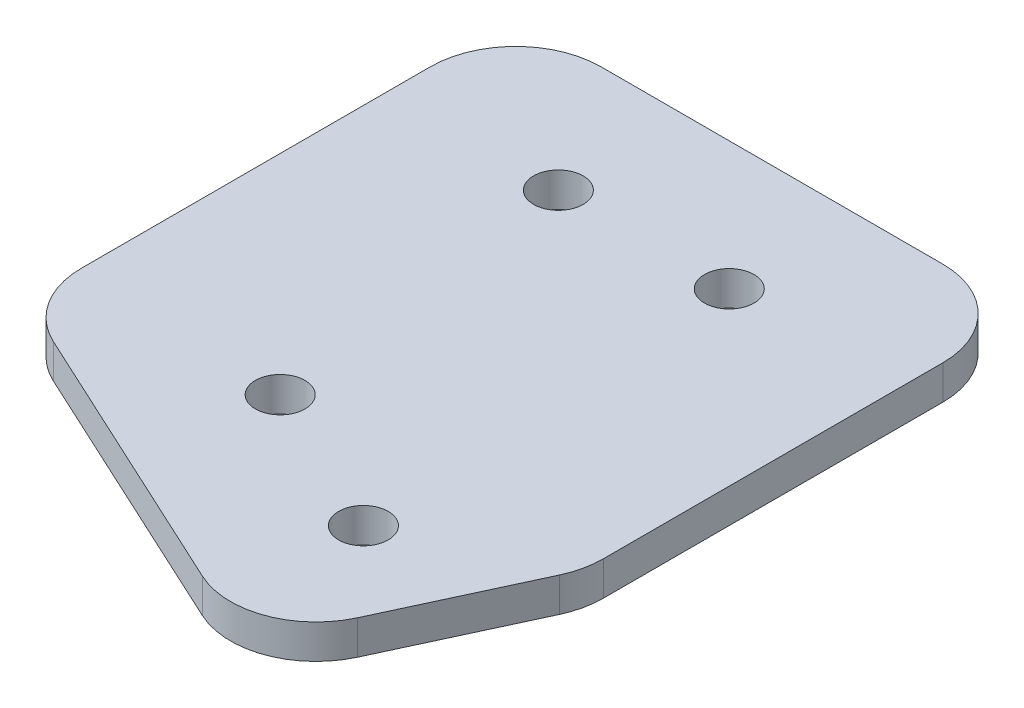
ISO-10303-21;
HEADER;
FILE_DESCRIPTION(('STEP AP214'),'2;1');
FILE_NAME('part.step','',(''),(''),'','','');
FILE_SCHEMA(('AUTOMOTIVE_DESIGN { 1 0 10303 214 1 1 1 1 }'));
ENDSEC;
DATA;
#1=APPLICATION_CONTEXT('core data for automotive mechanical design processes');
#2=APPLICATION_PROTOCOL_DEFINITION('international standard','automotive_design',2000,#1);
#3=PRODUCT_CONTEXT('',#1,'mechanical');
#4=PRODUCT('Part','Part','',(#3));
#5=PRODUCT_RELATED_PRODUCT_CATEGORY('part','',(#4));
#6=PRODUCT_DEFINITION_FORMATION('','',#4);
#7=PRODUCT_DEFINITION_CONTEXT('part definition',#1,'design');
#8=PRODUCT_DEFINITION('design','',#6,#7);
#9=PRODUCT_DEFINITION_SHAPE('','',#8);
#10=(LENGTH_UNIT() NAMED_UNIT(*) SI_UNIT(.MILLI.,.METRE.));
#11=(NAMED_UNIT(*) PLANE_ANGLE_UNIT() SI_UNIT($,.RADIAN.));
#12=(NAMED_UNIT(*) SI_UNIT($,.STERADIAN.) SOLID_ANGLE_UNIT());
#13=UNCERTAINTY_MEASURE_WITH_UNIT(LENGTH_MEASURE(1.E-05),#10,'distance_accuracy_value','');
#14=(GEOMETRIC_REPRESENTATION_CONTEXT(3) GLOBAL_UNCERTAINTY_ASSIGNED_CONTEXT((#13)) GLOBAL_UNIT_ASSIGNED_CONTEXT((#10,
#11,#12)) REPRESENTATION_CONTEXT('',''));
#15=CARTESIAN_POINT('',(0.,0.,0.));
#16=DIRECTION('',(0.,0.,1.));
#17=DIRECTION('',(1.,0.,0.));
#18=AXIS2_PLACEMENT_3D('',#15,#16,#17);
#19=CARTESIAN_POINT('',(0.,2.,0.));
#20=DIRECTION('',(0.,-1.,0.));
#21=DIRECTION('',(0.,0.,-1.));
#22=AXIS2_PLACEMENT_3D('',#19,#20,#21);
#23=PLANE('',#22);
#24=DIRECTION('',(0.420286622180708,0.,-0.907391401334579));
#25=VECTOR('',#24,1.);
#26=CARTESIAN_POINT('',(-206.304299332711,2.,-87.2908173820101));
#27=LINE('',#26,#25);
#28=CARTESIAN_POINT('',(-204.202866221808,2.,-91.827774388683));
#29=VERTEX_POINT('',#28);
#30=CARTESIAN_POINT('',(-200.463042993328,2.,-99.9019867498249));
#31=VERTEX_POINT('',#30);
#32=EDGE_CURVE('E212',#29,#31,#27,.T.);
#33=ORIENTED_EDGE('',*,*,#32,.T.);
#34=CARTESIAN_POINT('',(-205.000000000001,2.,-102.003419860728));
#35=DIRECTION('',(0.,-1.,0.));
#36=DIRECTION('',(0.,0.,-1.));
#37=AXIS2_PLACEMENT_3D('',#34,#35,#36);
#38=CIRCLE('',#37,5.);
#39=CARTESIAN_POINT('',(-200.000000000001,2.,-102.003419860728));
#40=VERTEX_POINT('',#39);
#41=EDGE_CURVE('E176',#31,#40,#38,.F.);
#42=ORIENTED_EDGE('',*,*,#41,.T.);
#43=DIRECTION('',(0.,0.,-1.));
#44=VECTOR('',#43,1.);
#45=CARTESIAN_POINT('',(-200.000000000001,2.,-126.877091055187));
#46=LINE('',#45,#44);
#47=CARTESIAN_POINT('',(-200.000000000001,2.,-121.877091055187));
#48=VERTEX_POINT('',#47);
#49=EDGE_CURVE('E142',#40,#48,#46,.T.);
#50=ORIENTED_EDGE('',*,*,#49,.T.);
#51=CARTESIAN_POINT('',(-205.000000000001,2.,-121.877091055187));
#52=DIRECTION('',(0.,-1.,0.));
#53=DIRECTION('',(0.,0.,-1.));
#54=AXIS2_PLACEMENT_3D('',#51,#52,#53);
#55=CIRCLE('',#54,5.);
#56=CARTESIAN_POINT('',(-205.000000000001,2.,-126.877091055187));
#57=VERTEX_POINT('',#56);
#58=EDGE_CURVE('E171',#48,#57,#55,.F.);
#59=ORIENTED_EDGE('',*,*,#58,.T.);
#60=DIRECTION('',(-1.,0.,0.));
#61=VECTOR('',#60,1.);
#62=CARTESIAN_POINT('',(-229.999999999999,2.,-126.877091055186));
#63=LINE('',#62,#61);
#64=CARTESIAN_POINT('',(-224.999999999999,2.,-126.877091055186));
#65=VERTEX_POINT('',#64);
#66=EDGE_CURVE('E150',#57,#65,#63,.T.);
#67=ORIENTED_EDGE('',*,*,#66,.T.);
#68=CARTESIAN_POINT('',(-224.999999999999,2.,-121.877091055186));
#69=DIRECTION('',(0.,-1.,0.));
#70=DIRECTION('',(0.,0.,-1.));
#71=AXIS2_PLACEMENT_3D('',#68,#69,#70);
#72=CIRCLE('',#71,5.);
#73=CARTESIAN_POINT('',(-229.999999999999,2.,-121.877091055186));
#74=VERTEX_POINT('',#73);
#75=EDGE_CURVE('E169',#65,#74,#72,.F.);
#76=ORIENTED_EDGE('',*,*,#75,.T.);
#77=DIRECTION('',(0.,0.,1.));
#78=VECTOR('',#77,1.);
#79=CARTESIAN_POINT('',(-229.999999999999,2.,-126.877091055186));
#80=LINE('',#79,#78);
#81=CARTESIAN_POINT('',(-229.999999999999,2.,-101.460615402848));
#82=VERTEX_POINT('',#81);
#83=EDGE_CURVE('E154',#74,#82,#80,.T.);
#84=ORIENTED_EDGE('',*,*,#83,.T.);
#85=CARTESIAN_POINT('',(-224.999999999999,2.,-101.460615402848));
#86=DIRECTION('',(0.,-1.,0.));
#87=DIRECTION('',(0.,0.,-1.));
#88=AXIS2_PLACEMENT_3D('',#85,#86,#87);
#89=CIRCLE('',#88,5.);
#90=CARTESIAN_POINT('',(-227.101433110903,2.,-96.9236583961751));
#91=VERTEX_POINT('',#90);
#92=EDGE_CURVE('E65',#82,#91,#89,.F.);
#93=ORIENTED_EDGE('',*,*,#92,.T.);
#94=DIRECTION('',(0.90739140133458,0.,0.420286622180706));
#95=VECTOR('',#94,1.);
#96=CARTESIAN_POINT('',(-229.999999999999,2.,-98.2662200351673));
#97=LINE('',#96,#95);
#98=CARTESIAN_POINT('',(-210.841256339384,2.,-89.3922504929136));
#99=VERTEX_POINT('',#98);
#100=EDGE_CURVE('E214',#91,#99,#97,.T.);
#101=ORIENTED_EDGE('',*,*,#100,.T.);
#102=CARTESIAN_POINT('',(-208.739823228481,2.,-93.9292074995865));
#103=DIRECTION('',(0.,-1.,0.));
#104=DIRECTION('',(0.,0.,-1.));
#105=AXIS2_PLACEMENT_3D('',#102,#103,#104);
#106=CIRCLE('',#105,5.);
#107=EDGE_CURVE('E174',#99,#29,#106,.F.);
#108=ORIENTED_EDGE('',*,*,#107,.T.);
#109=EDGE_LOOP('',(#33,#42,#50,#59,#67,#76,#84,#93,#101,#108));
#110=FACE_BOUND('',#109,.T.);
#111=CARTESIAN_POINT('',(-217.773936320299,2.,-100.86878932337));
#112=DIRECTION('',(0.,1.,0.));
#113=DIRECTION('',(0.,0.,1.));
#114=AXIS2_PLACEMENT_3D('',#111,#112,#113);
#115=CIRCLE('',#114,1.45000000000113);
#116=CARTESIAN_POINT('',(-217.773936320299,2.,-99.4187893233691));
#117=VERTEX_POINT('',#116);
#118=EDGE_CURVE('E208',#117,#117,#115,.T.);
#119=ORIENTED_EDGE('',*,*,#118,.F.);
#120=EDGE_LOOP('',(#119));
#121=FACE_BOUND('',#120,.T.);
#122=CARTESIAN_POINT('',(-208.700022306954,2.,-96.6659231015631));
#123=DIRECTION('',(0.,1.,0.));
#124=DIRECTION('',(0.,0.,1.));
#125=AXIS2_PLACEMENT_3D('',#122,#123,#124);
#126=CIRCLE('',#125,1.45000000000113);
#127=CARTESIAN_POINT('',(-208.700022306954,2.,-95.215923101562));
#128=VERTEX_POINT('',#127);
#129=EDGE_CURVE('E220',#128,#128,#126,.T.);
#130=ORIENTED_EDGE('',*,*,#129,.F.);
#131=EDGE_LOOP('',(#130));
#132=FACE_BOUND('',#131,.T.);
#133=CARTESIAN_POINT('',(-219.999999999999,2.,-119.377091055186));
#134=DIRECTION('',(0.,1.,0.));
#135=DIRECTION('',(0.,0.,1.));
#136=AXIS2_PLACEMENT_3D('',#133,#134,#135);
#137=CIRCLE('',#136,1.45);
#138=CARTESIAN_POINT('',(-219.999999999999,2.,-117.927091055186));
#139=VERTEX_POINT('',#138);
#140=EDGE_CURVE('E226',#139,#139,#137,.T.);
#141=ORIENTED_EDGE('',*,*,#140,.F.);
#142=EDGE_LOOP('',(#141));
#143=FACE_BOUND('',#142,.T.);
#144=CARTESIAN_POINT('',(-209.999999999999,2.,-119.377091055186));
#145=DIRECTION('',(0.,1.,0.));
#146=DIRECTION('',(0.,0.,1.));
#147=AXIS2_PLACEMENT_3D('',#144,#145,#146);
#148=CIRCLE('',#147,1.45);
#149=CARTESIAN_POINT('',(-209.999999999999,2.,-117.927091055186));
#150=VERTEX_POINT('',#149);
#151=EDGE_CURVE('E232',#150,#150,#148,.T.);
#152=ORIENTED_EDGE('',*,*,#151,.F.);
#153=EDGE_LOOP('',(#152));
#154=FACE_BOUND('',#153,.T.);
#155=ADVANCED_FACE('F43',(#110,#121,#132,#143,#154),#23,.F.);
#156=CARTESIAN_POINT('',(0.,0.,0.));
#157=DIRECTION('',(0.,-1.,0.));
#158=DIRECTION('',(0.,0.,-1.));
#159=AXIS2_PLACEMENT_3D('',#156,#157,#158);
#160=PLANE('',#159);
#161=CARTESIAN_POINT('',(-219.999999999999,0.,-119.377091055186));
#162=DIRECTION('',(0.,1.,0.));
#163=DIRECTION('',(0.,0.,1.));
#164=AXIS2_PLACEMENT_3D('',#161,#162,#163);
#165=CIRCLE('',#164,1.45);
#166=CARTESIAN_POINT('',(-219.999999999999,0.,-117.927091055186));
#167=VERTEX_POINT('',#166);
#168=EDGE_CURVE('E229',#167,#167,#165,.T.);
#169=ORIENTED_EDGE('',*,*,#168,.T.);
#170=EDGE_LOOP('',(#169));
#171=FACE_BOUND('',#170,.T.);
#172=CARTESIAN_POINT('',(-217.773936320299,0.,-100.86878932337));
#173=DIRECTION('',(0.,1.,0.));
#174=DIRECTION('',(0.,0.,1.));
#175=AXIS2_PLACEMENT_3D('',#172,#173,#174);
#176=CIRCLE('',#175,1.45000000000113);
#177=CARTESIAN_POINT('',(-217.773936320299,0.,-99.4187893233691));
#178=VERTEX_POINT('',#177);
#179=EDGE_CURVE('E217',#178,#178,#176,.T.);
#180=ORIENTED_EDGE('',*,*,#179,.T.);
#181=EDGE_LOOP('',(#180));
#182=FACE_BOUND('',#181,.T.);
#183=DIRECTION('',(0.,0.,-1.));
#184=VECTOR('',#183,1.);
#185=CARTESIAN_POINT('',(-200.000000000001,0.,-126.877091055187));
#186=LINE('',#185,#184);
#187=CARTESIAN_POINT('',(-200.000000000001,0.,-102.003419860728));
#188=VERTEX_POINT('',#187);
#189=CARTESIAN_POINT('',(-200.000000000001,0.,-121.877091055187));
#190=VERTEX_POINT('',#189);
#191=EDGE_CURVE('E139',#188,#190,#186,.T.);
#192=ORIENTED_EDGE('',*,*,#191,.F.);
#193=CARTESIAN_POINT('',(-205.000000000001,0.,-102.003419860728));
#194=DIRECTION('',(0.,-1.,0.));
#195=DIRECTION('',(0.,0.,-1.));
#196=AXIS2_PLACEMENT_3D('',#193,#194,#195);
#197=CIRCLE('',#196,5.);
#198=CARTESIAN_POINT('',(-200.463042993328,0.,-99.9019867498249));
#199=VERTEX_POINT('',#198);
#200=EDGE_CURVE('E122',#188,#199,#197,.T.);
#201=ORIENTED_EDGE('',*,*,#200,.T.);
#202=DIRECTION('',(0.420286622180708,0.,-0.907391401334579));
#203=VECTOR('',#202,1.);
#204=CARTESIAN_POINT('',(-206.304299332711,0.,-87.2908173820101));
#205=LINE('',#204,#203);
#206=CARTESIAN_POINT('',(-204.202866221808,0.,-91.827774388683));
#207=VERTEX_POINT('',#206);
#208=EDGE_CURVE('E151',#207,#199,#205,.T.);
#209=ORIENTED_EDGE('',*,*,#208,.F.);
#210=CARTESIAN_POINT('',(-208.739823228481,0.,-93.9292074995865));
#211=DIRECTION('',(0.,-1.,0.));
#212=DIRECTION('',(0.,0.,-1.));
#213=AXIS2_PLACEMENT_3D('',#210,#211,#212);
#214=CIRCLE('',#213,5.);
#215=CARTESIAN_POINT('',(-210.841256339384,0.,-89.3922504929136));
#216=VERTEX_POINT('',#215);
#217=EDGE_CURVE('E133',#207,#216,#214,.T.);
#218=ORIENTED_EDGE('',*,*,#217,.T.);
#219=DIRECTION('',(0.90739140133458,0.,0.420286622180706));
#220=VECTOR('',#219,1.);
#221=CARTESIAN_POINT('',(-229.999999999999,0.,-98.2662200351673));
#222=LINE('',#221,#220);
#223=CARTESIAN_POINT('',(-227.101433110903,0.,-96.9236583961751));
#224=VERTEX_POINT('',#223);
#225=EDGE_CURVE('E156',#224,#216,#222,.T.);
#226=ORIENTED_EDGE('',*,*,#225,.F.);
#227=CARTESIAN_POINT('',(-224.999999999999,0.,-101.460615402848));
#228=DIRECTION('',(0.,-1.,0.));
#229=DIRECTION('',(0.,0.,-1.));
#230=AXIS2_PLACEMENT_3D('',#227,#228,#229);
#231=CIRCLE('',#230,5.);
#232=CARTESIAN_POINT('',(-229.999999999999,0.,-101.460615402848));
#233=VERTEX_POINT('',#232);
#234=EDGE_CURVE('E163',#224,#233,#231,.T.);
#235=ORIENTED_EDGE('',*,*,#234,.T.);
#236=DIRECTION('',(0.,0.,1.));
#237=VECTOR('',#236,1.);
#238=CARTESIAN_POINT('',(-229.999999999999,0.,-126.877091055186));
#239=LINE('',#238,#237);
#240=CARTESIAN_POINT('',(-229.999999999999,0.,-121.877091055186));
#241=VERTEX_POINT('',#240);
#242=EDGE_CURVE('E204',#241,#233,#239,.T.);
#243=ORIENTED_EDGE('',*,*,#242,.F.);
#244=CARTESIAN_POINT('',(-224.999999999999,0.,-121.877091055186));
#245=DIRECTION('',(0.,-1.,0.));
#246=DIRECTION('',(0.,0.,-1.));
#247=AXIS2_PLACEMENT_3D('',#244,#245,#246);
#248=CIRCLE('',#247,5.);
#249=CARTESIAN_POINT('',(-224.999999999999,0.,-126.877091055186));
#250=VERTEX_POINT('',#249);
#251=EDGE_CURVE('E143',#241,#250,#248,.T.);
#252=ORIENTED_EDGE('',*,*,#251,.T.);
#253=DIRECTION('',(-1.,0.,0.));
#254=VECTOR('',#253,1.);
#255=CARTESIAN_POINT('',(-229.999999999999,0.,-126.877091055186));
#256=LINE('',#255,#254);
#257=CARTESIAN_POINT('',(-205.000000000001,0.,-126.877091055187));
#258=VERTEX_POINT('',#257);
#259=EDGE_CURVE('E192',#258,#250,#256,.T.);
#260=ORIENTED_EDGE('',*,*,#259,.F.);
#261=CARTESIAN_POINT('',(-205.000000000001,0.,-121.877091055187));
#262=DIRECTION('',(0.,-1.,0.));
#263=DIRECTION('',(0.,0.,-1.));
#264=AXIS2_PLACEMENT_3D('',#261,#262,#263);
#265=CIRCLE('',#264,5.);
#266=EDGE_CURVE('E149',#258,#190,#265,.T.);
#267=ORIENTED_EDGE('',*,*,#266,.T.);
#268=EDGE_LOOP('',(#192,#201,#209,#218,#226,#235,#243,#252,#260,#267));
#269=FACE_BOUND('',#268,.T.);
#270=CARTESIAN_POINT('',(-208.700022306954,0.,-96.6659231015631));
#271=DIRECTION('',(0.,1.,0.));
#272=DIRECTION('',(0.,0.,1.));
#273=AXIS2_PLACEMENT_3D('',#270,#271,#272);
#274=CIRCLE('',#273,1.45000000000113);
#275=CARTESIAN_POINT('',(-208.700022306954,0.,-95.215923101562));
#276=VERTEX_POINT('',#275);
#277=EDGE_CURVE('E223',#276,#276,#274,.T.);
#278=ORIENTED_EDGE('',*,*,#277,.T.);
#279=EDGE_LOOP('',(#278));
#280=FACE_BOUND('',#279,.T.);
#281=CARTESIAN_POINT('',(-209.999999999999,0.,-119.377091055186));
#282=DIRECTION('',(0.,1.,0.));
#283=DIRECTION('',(0.,0.,1.));
#284=AXIS2_PLACEMENT_3D('',#281,#282,#283);
#285=CIRCLE('',#284,1.45);
#286=CARTESIAN_POINT('',(-209.999999999999,0.,-117.927091055186));
#287=VERTEX_POINT('',#286);
#288=EDGE_CURVE('E235',#287,#287,#285,.T.);
#289=ORIENTED_EDGE('',*,*,#288,.T.);
#290=EDGE_LOOP('',(#289));
#291=FACE_BOUND('',#290,.T.);
#292=ADVANCED_FACE('F146',(#171,#182,#269,#280,#291),#160,.T.);
#293=CARTESIAN_POINT('',(-229.999999999999,2.,-126.877091055186));
#294=DIRECTION('',(0.,0.,1.));
#295=DIRECTION('',(1.,0.,0.));
#296=AXIS2_PLACEMENT_3D('',#293,#294,#295);
#297=PLANE('',#296);
#298=ORIENTED_EDGE('',*,*,#66,.F.);
#299=DIRECTION('',(0.,-1.,0.));
#300=VECTOR('',#299,1.);
#301=CARTESIAN_POINT('',(-205.000000000001,2.,-126.877091055187));
#302=LINE('',#301,#300);
#303=EDGE_CURVE('E11',#57,#258,#302,.T.);
#304=ORIENTED_EDGE('',*,*,#303,.T.);
#305=ORIENTED_EDGE('',*,*,#259,.T.);
#306=DIRECTION('',(0.,-1.,0.));
#307=VECTOR('',#306,1.);
#308=CARTESIAN_POINT('',(-224.999999999999,2.,-126.877091055186));
#309=LINE('',#308,#307);
#310=EDGE_CURVE('E51',#250,#65,#309,.F.);
#311=ORIENTED_EDGE('',*,*,#310,.T.);
#312=EDGE_LOOP('',(#298,#304,#305,#311));
#313=FACE_BOUND('',#312,.T.);
#314=ADVANCED_FACE('F190',(#313),#297,.F.);
#315=CARTESIAN_POINT('',(-229.999999999999,2.,-126.877091055186));
#316=DIRECTION('',(1.,0.,0.));
#317=DIRECTION('',(0.,0.,-1.));
#318=AXIS2_PLACEMENT_3D('',#315,#316,#317);
#319=PLANE('',#318);
#320=ORIENTED_EDGE('',*,*,#242,.T.);
#321=DIRECTION('',(0.,-1.,0.));
#322=VECTOR('',#321,1.);
#323=CARTESIAN_POINT('',(-229.999999999999,2.,-101.460615402848));
#324=LINE('',#323,#322);
#325=EDGE_CURVE('E185',#233,#82,#324,.F.);
#326=ORIENTED_EDGE('',*,*,#325,.T.);
#327=ORIENTED_EDGE('',*,*,#83,.F.);
#328=DIRECTION('',(0.,-1.,0.));
#329=VECTOR('',#328,1.);
#330=CARTESIAN_POINT('',(-229.999999999999,2.,-121.877091055186));
#331=LINE('',#330,#329);
#332=EDGE_CURVE('E182',#74,#241,#331,.T.);
#333=ORIENTED_EDGE('',*,*,#332,.T.);
#334=EDGE_LOOP('',(#320,#326,#327,#333));
#335=FACE_BOUND('',#334,.T.);
#336=ADVANCED_FACE('F203',(#335),#319,.F.);
#337=CARTESIAN_POINT('',(-229.999999999999,2.,-98.2662200351673));
#338=DIRECTION('',(0.420286622180706,0.,-0.90739140133458));
#339=DIRECTION('',(-0.90739140133458,0.,-0.420286622180706));
#340=AXIS2_PLACEMENT_3D('',#337,#338,#339);
#341=PLANE('',#340);
#342=ORIENTED_EDGE('',*,*,#225,.T.);
#343=DIRECTION('',(0.,-1.,0.));
#344=VECTOR('',#343,1.);
#345=CARTESIAN_POINT('',(-210.841256339384,2.,-89.3922504929137));
#346=LINE('',#345,#344);
#347=EDGE_CURVE('E58',#216,#99,#346,.F.);
#348=ORIENTED_EDGE('',*,*,#347,.T.);
#349=ORIENTED_EDGE('',*,*,#100,.F.);
#350=DIRECTION('',(0.,-1.,0.));
#351=VECTOR('',#350,1.);
#352=CARTESIAN_POINT('',(-227.101433110903,2.,-96.9236583961751));
#353=LINE('',#352,#351);
#354=EDGE_CURVE('E178',#91,#224,#353,.T.);
#355=ORIENTED_EDGE('',*,*,#354,.T.);
#356=EDGE_LOOP('',(#342,#348,#349,#355));
#357=FACE_BOUND('',#356,.T.);
#358=ADVANCED_FACE('F261',(#357),#341,.F.);
#359=CARTESIAN_POINT('',(-206.304299332711,2.,-87.2908173820101));
#360=DIRECTION('',(-0.907391401334579,0.,-0.420286622180708));
#361=DIRECTION('',(-0.420286622180708,0.,0.907391401334579));
#362=AXIS2_PLACEMENT_3D('',#359,#360,#361);
#363=PLANE('',#362);
#364=ORIENTED_EDGE('',*,*,#208,.T.);
#365=DIRECTION('',(0.,-1.,0.));
#366=VECTOR('',#365,1.);
#367=CARTESIAN_POINT('',(-200.463042993328,2.,-99.9019867498249));
#368=LINE('',#367,#366);
#369=EDGE_CURVE('E127',#199,#31,#368,.F.);
#370=ORIENTED_EDGE('',*,*,#369,.T.);
#371=ORIENTED_EDGE('',*,*,#32,.F.);
#372=DIRECTION('',(0.,-1.,0.));
#373=VECTOR('',#372,1.);
#374=CARTESIAN_POINT('',(-204.202866221808,2.,-91.827774388683));
#375=LINE('',#374,#373);
#376=EDGE_CURVE('E132',#29,#207,#375,.T.);
#377=ORIENTED_EDGE('',*,*,#376,.T.);
#378=EDGE_LOOP('',(#364,#370,#371,#377));
#379=FACE_BOUND('',#378,.T.);
#380=ADVANCED_FACE('F258',(#379),#363,.F.);
#381=CARTESIAN_POINT('',(-200.000000000001,2.,-126.877091055187));
#382=DIRECTION('',(-1.,0.,0.));
#383=DIRECTION('',(0.,0.,1.));
#384=AXIS2_PLACEMENT_3D('',#381,#382,#383);
#385=PLANE('',#384);
#386=ORIENTED_EDGE('',*,*,#49,.F.);
#387=DIRECTION('',(0.,-1.,0.));
#388=VECTOR('',#387,1.);
#389=CARTESIAN_POINT('',(-200.000000000001,2.,-102.003419860728));
#390=LINE('',#389,#388);
#391=EDGE_CURVE('E126',#40,#188,#390,.T.);
#392=ORIENTED_EDGE('',*,*,#391,.T.);
#393=ORIENTED_EDGE('',*,*,#191,.T.);
#394=DIRECTION('',(0.,-1.,0.));
#395=VECTOR('',#394,1.);
#396=CARTESIAN_POINT('',(-200.000000000001,2.,-121.877091055187));
#397=LINE('',#396,#395);
#398=EDGE_CURVE('E144',#190,#48,#397,.F.);
#399=ORIENTED_EDGE('',*,*,#398,.T.);
#400=EDGE_LOOP('',(#386,#392,#393,#399));
#401=FACE_BOUND('',#400,.T.);
#402=ADVANCED_FACE('F138',(#401),#385,.F.);
#403=CARTESIAN_POINT('',(-217.773936320299,2.,-100.86878932337));
#404=DIRECTION('',(0.,-1.,0.));
#405=DIRECTION('',(0.,0.,-1.));
#406=AXIS2_PLACEMENT_3D('',#403,#404,#405);
#407=CYLINDRICAL_SURFACE('',#406,1.45000000000113);
#408=ORIENTED_EDGE('',*,*,#118,.T.);
#409=EDGE_LOOP('',(#408));
#410=FACE_BOUND('',#409,.T.);
#411=ORIENTED_EDGE('',*,*,#179,.F.);
#412=EDGE_LOOP('',(#411));
#413=FACE_BOUND('',#412,.T.);
#414=ADVANCED_FACE('F253',(#410,#413),#407,.F.);
#415=CARTESIAN_POINT('',(-208.700022306954,2.,-96.6659231015631));
#416=DIRECTION('',(0.,-1.,0.));
#417=DIRECTION('',(0.,0.,-1.));
#418=AXIS2_PLACEMENT_3D('',#415,#416,#417);
#419=CYLINDRICAL_SURFACE('',#418,1.45000000000113);
#420=ORIENTED_EDGE('',*,*,#129,.T.);
#421=EDGE_LOOP('',(#420));
#422=FACE_BOUND('',#421,.T.);
#423=ORIENTED_EDGE('',*,*,#277,.F.);
#424=EDGE_LOOP('',(#423));
#425=FACE_BOUND('',#424,.T.);
#426=ADVANCED_FACE('F330',(#422,#425),#419,.F.);
#427=CARTESIAN_POINT('',(-219.999999999999,2.,-119.377091055186));
#428=DIRECTION('',(0.,-1.,0.));
#429=DIRECTION('',(0.,0.,-1.));
#430=AXIS2_PLACEMENT_3D('',#427,#428,#429);
#431=CYLINDRICAL_SURFACE('',#430,1.45);
#432=ORIENTED_EDGE('',*,*,#140,.T.);
#433=EDGE_LOOP('',(#432));
#434=FACE_BOUND('',#433,.T.);
#435=ORIENTED_EDGE('',*,*,#168,.F.);
#436=EDGE_LOOP('',(#435));
#437=FACE_BOUND('',#436,.T.);
#438=ADVANCED_FACE('F321',(#434,#437),#431,.F.);
#439=CARTESIAN_POINT('',(-209.999999999999,2.,-119.377091055186));
#440=DIRECTION('',(0.,-1.,0.));
#441=DIRECTION('',(0.,0.,-1.));
#442=AXIS2_PLACEMENT_3D('',#439,#440,#441);
#443=CYLINDRICAL_SURFACE('',#442,1.45);
#444=ORIENTED_EDGE('',*,*,#151,.T.);
#445=EDGE_LOOP('',(#444));
#446=FACE_BOUND('',#445,.T.);
#447=ORIENTED_EDGE('',*,*,#288,.F.);
#448=EDGE_LOOP('',(#447));
#449=FACE_BOUND('',#448,.T.);
#450=ADVANCED_FACE('F241',(#446,#449),#443,.F.);
#451=CARTESIAN_POINT('',(-205.000000000001,2.,-102.003419860728));
#452=DIRECTION('',(0.,-1.,0.));
#453=DIRECTION('',(0.,0.,-1.));
#454=AXIS2_PLACEMENT_3D('',#451,#452,#453);
#455=CYLINDRICAL_SURFACE('',#454,5.);
#456=ORIENTED_EDGE('',*,*,#41,.F.);
#457=ORIENTED_EDGE('',*,*,#369,.F.);
#458=ORIENTED_EDGE('',*,*,#200,.F.);
#459=ORIENTED_EDGE('',*,*,#391,.F.);
#460=EDGE_LOOP('',(#456,#457,#458,#459));
#461=FACE_BOUND('',#460,.T.);
#462=ADVANCED_FACE('F125',(#461),#455,.T.);
#463=CARTESIAN_POINT('',(-208.739823228481,2.,-93.9292074995865));
#464=DIRECTION('',(0.,-1.,0.));
#465=DIRECTION('',(0.,0.,-1.));
#466=AXIS2_PLACEMENT_3D('',#463,#464,#465);
#467=CYLINDRICAL_SURFACE('',#466,5.);
#468=ORIENTED_EDGE('',*,*,#107,.F.);
#469=ORIENTED_EDGE('',*,*,#347,.F.);
#470=ORIENTED_EDGE('',*,*,#217,.F.);
#471=ORIENTED_EDGE('',*,*,#376,.F.);
#472=EDGE_LOOP('',(#468,#469,#470,#471));
#473=FACE_BOUND('',#472,.T.);
#474=ADVANCED_FACE('F271',(#473),#467,.T.);
#475=CARTESIAN_POINT('',(-224.999999999999,2.,-101.460615402848));
#476=DIRECTION('',(0.,-1.,0.));
#477=DIRECTION('',(0.,0.,-1.));
#478=AXIS2_PLACEMENT_3D('',#475,#476,#477);
#479=CYLINDRICAL_SURFACE('',#478,5.);
#480=ORIENTED_EDGE('',*,*,#92,.F.);
#481=ORIENTED_EDGE('',*,*,#325,.F.);
#482=ORIENTED_EDGE('',*,*,#234,.F.);
#483=ORIENTED_EDGE('',*,*,#354,.F.);
#484=EDGE_LOOP('',(#480,#481,#482,#483));
#485=FACE_BOUND('',#484,.T.);
#486=ADVANCED_FACE('F274',(#485),#479,.T.);
#487=CARTESIAN_POINT('',(-205.000000000001,2.,-121.877091055187));
#488=DIRECTION('',(0.,-1.,0.));
#489=DIRECTION('',(0.,0.,-1.));
#490=AXIS2_PLACEMENT_3D('',#487,#488,#489);
#491=CYLINDRICAL_SURFACE('',#490,5.);
#492=ORIENTED_EDGE('',*,*,#58,.F.);
#493=ORIENTED_EDGE('',*,*,#398,.F.);
#494=ORIENTED_EDGE('',*,*,#266,.F.);
#495=ORIENTED_EDGE('',*,*,#303,.F.);
#496=EDGE_LOOP('',(#492,#493,#494,#495));
#497=FACE_BOUND('',#496,.T.);
#498=ADVANCED_FACE('F277',(#497),#491,.T.);
#499=CARTESIAN_POINT('',(-224.999999999999,2.,-121.877091055186));
#500=DIRECTION('',(0.,-1.,0.));
#501=DIRECTION('',(0.,0.,-1.));
#502=AXIS2_PLACEMENT_3D('',#499,#500,#501);
#503=CYLINDRICAL_SURFACE('',#502,5.);
#504=ORIENTED_EDGE('',*,*,#75,.F.);
#505=ORIENTED_EDGE('',*,*,#310,.F.);
#506=ORIENTED_EDGE('',*,*,#251,.F.);
#507=ORIENTED_EDGE('',*,*,#332,.F.);
#508=EDGE_LOOP('',(#504,#505,#506,#507));
#509=FACE_BOUND('',#508,.T.);
#510=ADVANCED_FACE('F45',(#509),#503,.T.);
#511=CLOSED_SHELL('',(#155,#292,#314,#336,#358,#380,#402,#414,#426,#438,#450,#462,#474,#486,
#498,#510));
#512=MANIFOLD_SOLID_BREP('B2',#511);
#513=ADVANCED_BREP_SHAPE_REPRESENTATION('',(#18,#512),#14);
#514=SHAPE_DEFINITION_REPRESENTATION(#9,#513);
ENDSEC;
END-ISO-10303-21;
